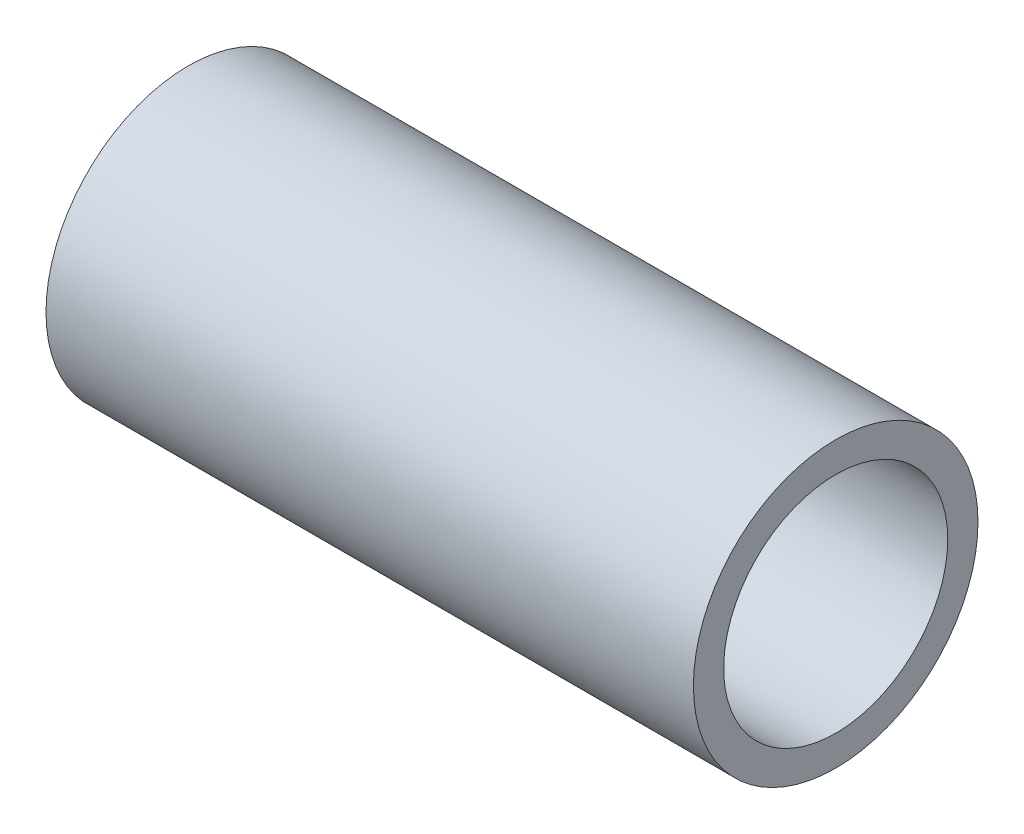
ISO-10303-21;
HEADER;
FILE_DESCRIPTION(('STEP AP214'),'2;1');
FILE_NAME('part.step','',(''),(''),'','','');
FILE_SCHEMA(('AUTOMOTIVE_DESIGN { 1 0 10303 214 1 1 1 1 }'));
ENDSEC;
DATA;
#1=APPLICATION_CONTEXT('core data for automotive mechanical design processes');
#2=APPLICATION_PROTOCOL_DEFINITION('international standard','automotive_design',2000,#1);
#3=PRODUCT_CONTEXT('',#1,'mechanical');
#4=PRODUCT('Part','Part','',(#3));
#5=PRODUCT_RELATED_PRODUCT_CATEGORY('part','',(#4));
#6=PRODUCT_DEFINITION_FORMATION('','',#4);
#7=PRODUCT_DEFINITION_CONTEXT('part definition',#1,'design');
#8=PRODUCT_DEFINITION('design','',#6,#7);
#9=PRODUCT_DEFINITION_SHAPE('','',#8);
#10=(LENGTH_UNIT() NAMED_UNIT(*) SI_UNIT(.MILLI.,.METRE.));
#11=(NAMED_UNIT(*) PLANE_ANGLE_UNIT() SI_UNIT($,.RADIAN.));
#12=(NAMED_UNIT(*) SI_UNIT($,.STERADIAN.) SOLID_ANGLE_UNIT());
#13=UNCERTAINTY_MEASURE_WITH_UNIT(LENGTH_MEASURE(1.E-05),#10,'distance_accuracy_value','');
#14=(GEOMETRIC_REPRESENTATION_CONTEXT(3) GLOBAL_UNCERTAINTY_ASSIGNED_CONTEXT((#13)) GLOBAL_UNIT_ASSIGNED_CONTEXT((#10,
#11,#12)) REPRESENTATION_CONTEXT('',''));
#15=CARTESIAN_POINT('',(0.,0.,0.));
#16=DIRECTION('',(0.,0.,1.));
#17=DIRECTION('',(1.,0.,0.));
#18=AXIS2_PLACEMENT_3D('',#15,#16,#17);
#19=CARTESIAN_POINT('',(20.828,0.,0.));
#20=DIRECTION('',(1.,0.,0.));
#21=DIRECTION('',(0.,0.,-1.));
#22=AXIS2_PLACEMENT_3D('',#19,#20,#21);
#23=PLANE('',#22);
#24=CARTESIAN_POINT('',(20.828,0.,0.));
#25=DIRECTION('',(1.,0.,0.));
#26=DIRECTION('',(0.,0.,-1.));
#27=AXIS2_PLACEMENT_3D('',#24,#25,#26);
#28=CIRCLE('',#27,8.001);
#29=CARTESIAN_POINT('',(20.828,0.,-8.001));
#30=VERTEX_POINT('',#29);
#31=EDGE_CURVE('E10',#30,#30,#28,.F.);
#32=ORIENTED_EDGE('',*,*,#31,.F.);
#33=EDGE_LOOP('',(#32));
#34=FACE_BOUND('',#33,.T.);
#35=CARTESIAN_POINT('',(20.828,0.,0.));
#36=DIRECTION('',(1.,0.,0.));
#37=DIRECTION('',(0.,0.,-1.));
#38=AXIS2_PLACEMENT_3D('',#35,#36,#37);
#39=CIRCLE('',#38,6.35);
#40=CARTESIAN_POINT('',(20.828,0.,-6.35));
#41=VERTEX_POINT('',#40);
#42=EDGE_CURVE('E38',#41,#41,#39,.T.);
#43=ORIENTED_EDGE('',*,*,#42,.F.);
#44=EDGE_LOOP('',(#43));
#45=FACE_BOUND('',#44,.T.);
#46=ADVANCED_FACE('F31',(#34,#45),#23,.T.);
#47=CARTESIAN_POINT('',(0.,0.,0.));
#48=DIRECTION('',(1.,0.,0.));
#49=DIRECTION('',(0.,0.,-1.));
#50=AXIS2_PLACEMENT_3D('',#47,#48,#49);
#51=PLANE('',#50);
#52=CARTESIAN_POINT('',(0.,0.,0.));
#53=DIRECTION('',(-1.,0.,0.));
#54=DIRECTION('',(0.,0.,1.));
#55=AXIS2_PLACEMENT_3D('',#52,#53,#54);
#56=CIRCLE('',#55,8.001);
#57=CARTESIAN_POINT('',(0.,0.,8.001));
#58=VERTEX_POINT('',#57);
#59=EDGE_CURVE('E52',#58,#58,#56,.T.);
#60=ORIENTED_EDGE('',*,*,#59,.T.);
#61=EDGE_LOOP('',(#60));
#62=FACE_BOUND('',#61,.T.);
#63=CARTESIAN_POINT('',(0.,0.,0.));
#64=DIRECTION('',(1.,0.,0.));
#65=DIRECTION('',(0.,0.,-1.));
#66=AXIS2_PLACEMENT_3D('',#63,#64,#65);
#67=CIRCLE('',#66,6.35);
#68=CARTESIAN_POINT('',(0.,0.,-6.35));
#69=VERTEX_POINT('',#68);
#70=EDGE_CURVE('E42',#69,#69,#67,.T.);
#71=ORIENTED_EDGE('',*,*,#70,.T.);
#72=EDGE_LOOP('',(#71));
#73=FACE_BOUND('',#72,.T.);
#74=ADVANCED_FACE('F80',(#62,#73),#51,.F.);
#75=CARTESIAN_POINT('',(20.828,0.,0.));
#76=DIRECTION('',(-1.,0.,0.));
#77=DIRECTION('',(0.,0.,1.));
#78=AXIS2_PLACEMENT_3D('',#75,#76,#77);
#79=CYLINDRICAL_SURFACE('',#78,10.16);
#80=CARTESIAN_POINT('',(-12.7,0.,0.));
#81=DIRECTION('',(-1.,0.,0.));
#82=DIRECTION('',(0.,0.,1.));
#83=AXIS2_PLACEMENT_3D('',#80,#81,#82);
#84=CIRCLE('',#83,10.16);
#85=CARTESIAN_POINT('',(-12.7,0.,10.16));
#86=VERTEX_POINT('',#85);
#87=EDGE_CURVE('E47',#86,#86,#84,.T.);
#88=ORIENTED_EDGE('',*,*,#87,.F.);
#89=EDGE_LOOP('',(#88));
#90=FACE_BOUND('',#89,.T.);
#91=CARTESIAN_POINT('',(33.528,0.,0.));
#92=DIRECTION('',(1.,0.,0.));
#93=DIRECTION('',(0.,0.,-1.));
#94=AXIS2_PLACEMENT_3D('',#91,#92,#93);
#95=CIRCLE('',#94,10.16);
#96=CARTESIAN_POINT('',(33.528,0.,-10.16));
#97=VERTEX_POINT('',#96);
#98=EDGE_CURVE('E55',#97,#97,#95,.T.);
#99=ORIENTED_EDGE('',*,*,#98,.F.);
#100=EDGE_LOOP('',(#99));
#101=FACE_BOUND('',#100,.T.);
#102=ADVANCED_FACE('F33',(#90,#101),#79,.T.);
#103=CARTESIAN_POINT('',(20.828,0.,0.));
#104=DIRECTION('',(-1.,0.,0.));
#105=DIRECTION('',(0.,0.,1.));
#106=AXIS2_PLACEMENT_3D('',#103,#104,#105);
#107=CYLINDRICAL_SURFACE('',#106,6.35);
#108=ORIENTED_EDGE('',*,*,#42,.T.);
#109=EDGE_LOOP('',(#108));
#110=FACE_BOUND('',#109,.T.);
#111=ORIENTED_EDGE('',*,*,#70,.F.);
#112=EDGE_LOOP('',(#111));
#113=FACE_BOUND('',#112,.T.);
#114=ADVANCED_FACE('F89',(#110,#113),#107,.F.);
#115=CARTESIAN_POINT('',(-12.7,0.,0.));
#116=DIRECTION('',(-1.,0.,0.));
#117=DIRECTION('',(0.,0.,1.));
#118=AXIS2_PLACEMENT_3D('',#115,#116,#117);
#119=PLANE('',#118);
#120=ORIENTED_EDGE('',*,*,#87,.T.);
#121=EDGE_LOOP('',(#120));
#122=FACE_BOUND('',#121,.T.);
#123=CARTESIAN_POINT('',(-12.7,0.,0.));
#124=DIRECTION('',(-1.,0.,0.));
#125=DIRECTION('',(0.,0.,1.));
#126=AXIS2_PLACEMENT_3D('',#123,#124,#125);
#127=CIRCLE('',#126,8.001);
#128=CARTESIAN_POINT('',(-12.7,0.,8.001));
#129=VERTEX_POINT('',#128);
#130=EDGE_CURVE('E51',#129,#129,#127,.T.);
#131=ORIENTED_EDGE('',*,*,#130,.F.);
#132=EDGE_LOOP('',(#131));
#133=FACE_BOUND('',#132,.T.);
#134=ADVANCED_FACE('F76',(#122,#133),#119,.T.);
#135=CARTESIAN_POINT('',(-12.7,0.,0.));
#136=DIRECTION('',(1.,0.,0.));
#137=DIRECTION('',(0.,0.,-1.));
#138=AXIS2_PLACEMENT_3D('',#135,#136,#137);
#139=CYLINDRICAL_SURFACE('',#138,8.001);
#140=ORIENTED_EDGE('',*,*,#130,.T.);
#141=EDGE_LOOP('',(#140));
#142=FACE_BOUND('',#141,.T.);
#143=ORIENTED_EDGE('',*,*,#59,.F.);
#144=EDGE_LOOP('',(#143));
#145=FACE_BOUND('',#144,.T.);
#146=ADVANCED_FACE('F68',(#142,#145),#139,.F.);
#147=CARTESIAN_POINT('',(33.528,0.,0.));
#148=DIRECTION('',(1.,0.,0.));
#149=DIRECTION('',(0.,0.,-1.));
#150=AXIS2_PLACEMENT_3D('',#147,#148,#149);
#151=PLANE('',#150);
#152=ORIENTED_EDGE('',*,*,#98,.T.);
#153=EDGE_LOOP('',(#152));
#154=FACE_BOUND('',#153,.T.);
#155=CARTESIAN_POINT('',(33.528,0.,0.));
#156=DIRECTION('',(1.,0.,0.));
#157=DIRECTION('',(0.,0.,-1.));
#158=AXIS2_PLACEMENT_3D('',#155,#156,#157);
#159=CIRCLE('',#158,8.001);
#160=CARTESIAN_POINT('',(33.528,0.,-8.001));
#161=VERTEX_POINT('',#160);
#162=EDGE_CURVE('E60',#161,#161,#159,.T.);
#163=ORIENTED_EDGE('',*,*,#162,.F.);
#164=EDGE_LOOP('',(#163));
#165=FACE_BOUND('',#164,.T.);
#166=ADVANCED_FACE('F66',(#154,#165),#151,.T.);
#167=CARTESIAN_POINT('',(33.528,0.,0.));
#168=DIRECTION('',(-1.,0.,0.));
#169=DIRECTION('',(0.,0.,1.));
#170=AXIS2_PLACEMENT_3D('',#167,#168,#169);
#171=CYLINDRICAL_SURFACE('',#170,8.001);
#172=ORIENTED_EDGE('',*,*,#162,.T.);
#173=EDGE_LOOP('',(#172));
#174=FACE_BOUND('',#173,.T.);
#175=ORIENTED_EDGE('',*,*,#31,.T.);
#176=EDGE_LOOP('',(#175));
#177=FACE_BOUND('',#176,.T.);
#178=ADVANCED_FACE('F64',(#174,#177),#171,.F.);
#179=CLOSED_SHELL('',(#46,#74,#102,#114,#134,#146,#166,#178));
#180=MANIFOLD_SOLID_BREP('B2',#179);
#181=ADVANCED_BREP_SHAPE_REPRESENTATION('',(#18,#180),#14);
#182=SHAPE_DEFINITION_REPRESENTATION(#9,#181);
ENDSEC;
END-ISO-10303-21;
